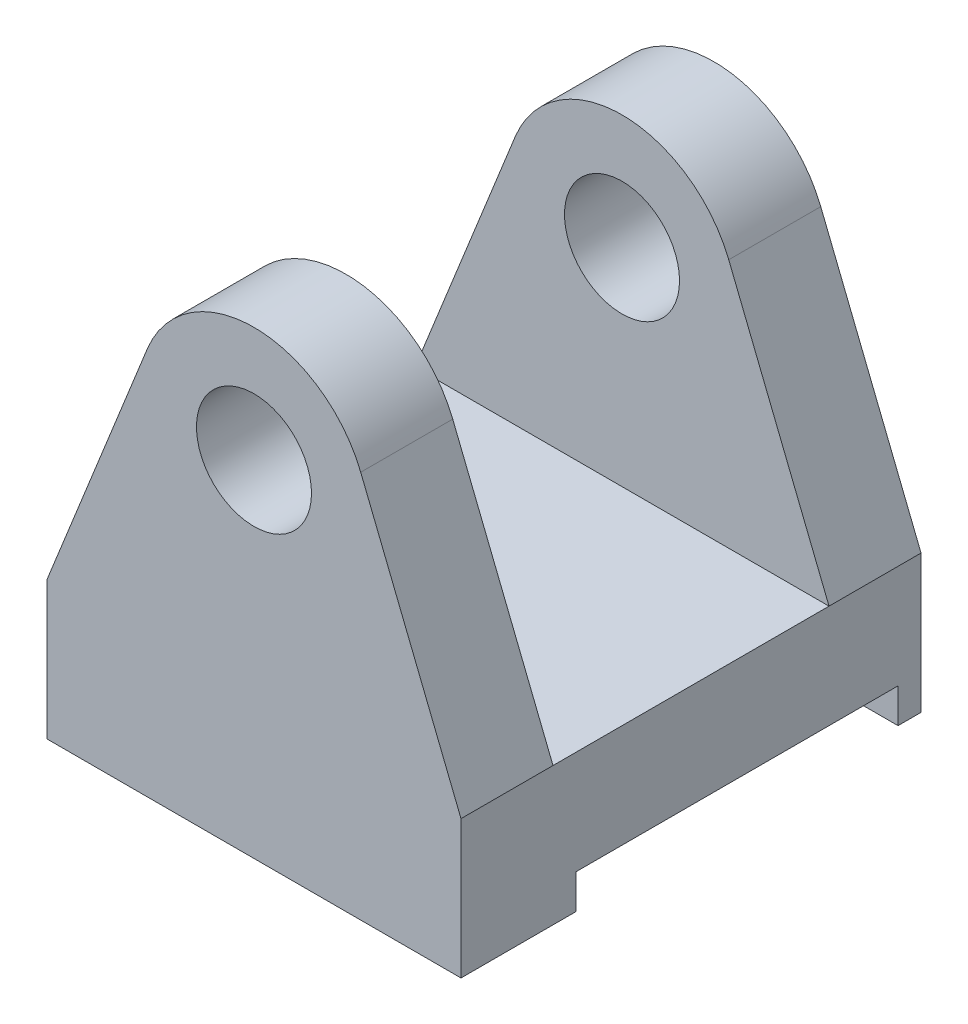
ISO-10303-21;
HEADER;
FILE_DESCRIPTION(('STEP AP214'),'2;1');
FILE_NAME('part.step','',(''),(''),'','','');
FILE_SCHEMA(('AUTOMOTIVE_DESIGN { 1 0 10303 214 1 1 1 1 }'));
ENDSEC;
DATA;
#1=APPLICATION_CONTEXT('core data for automotive mechanical design processes');
#2=APPLICATION_PROTOCOL_DEFINITION('international standard','automotive_design',2000,#1);
#3=PRODUCT_CONTEXT('',#1,'mechanical');
#4=PRODUCT('Part','Part','',(#3));
#5=PRODUCT_RELATED_PRODUCT_CATEGORY('part','',(#4));
#6=PRODUCT_DEFINITION_FORMATION('','',#4);
#7=PRODUCT_DEFINITION_CONTEXT('part definition',#1,'design');
#8=PRODUCT_DEFINITION('design','',#6,#7);
#9=PRODUCT_DEFINITION_SHAPE('','',#8);
#10=(LENGTH_UNIT() NAMED_UNIT(*) SI_UNIT(.MILLI.,.METRE.));
#11=(NAMED_UNIT(*) PLANE_ANGLE_UNIT() SI_UNIT($,.RADIAN.));
#12=(NAMED_UNIT(*) SI_UNIT($,.STERADIAN.) SOLID_ANGLE_UNIT());
#13=UNCERTAINTY_MEASURE_WITH_UNIT(LENGTH_MEASURE(1.E-05),#10,'distance_accuracy_value','');
#14=(GEOMETRIC_REPRESENTATION_CONTEXT(3) GLOBAL_UNCERTAINTY_ASSIGNED_CONTEXT((#13)) GLOBAL_UNIT_ASSIGNED_CONTEXT((#10,
#11,#12)) REPRESENTATION_CONTEXT('',''));
#15=CARTESIAN_POINT('',(0.,0.,0.));
#16=DIRECTION('',(0.,0.,1.));
#17=DIRECTION('',(1.,0.,0.));
#18=AXIS2_PLACEMENT_3D('',#15,#16,#17);
#19=CARTESIAN_POINT('',(-8.78834256779249,3.52734260085929,10.));
#20=DIRECTION('',(-0.928038883928868,0.372483328373313,0.));
#21=DIRECTION('',(-0.372483328373313,-0.928038883928868,0.));
#22=AXIS2_PLACEMENT_3D('',#19,#20,#21);
#23=PLANE('',#22);
#24=DIRECTION('',(0.,0.,-1.));
#25=VECTOR('',#24,1.);
#26=CARTESIAN_POINT('',(-4.64019441964434,13.8624166418666,10.));
#27=LINE('',#26,#25);
#28=CARTESIAN_POINT('',(-4.64019441964434,13.8624166418666,10.));
#29=VERTEX_POINT('',#28);
#30=CARTESIAN_POINT('',(-4.64019441964434,13.8624166418666,6.));
#31=VERTEX_POINT('',#30);
#32=EDGE_CURVE('E56',#29,#31,#27,.T.);
#33=ORIENTED_EDGE('',*,*,#32,.T.);
#34=DIRECTION('',(-0.372483328373313,-0.928038883928868,0.));
#35=VECTOR('',#34,1.);
#36=CARTESIAN_POINT('',(-8.78834256779249,3.52734260085929,6.));
#37=LINE('',#36,#35);
#38=CARTESIAN_POINT('',(-9.,3.,6.));
#39=VERTEX_POINT('',#38);
#40=EDGE_CURVE('E322',#31,#39,#37,.T.);
#41=ORIENTED_EDGE('',*,*,#40,.T.);
#42=DIRECTION('',(0.,0.,-1.));
#43=VECTOR('',#42,1.);
#44=CARTESIAN_POINT('',(-9.,3.,10.));
#45=LINE('',#44,#43);
#46=CARTESIAN_POINT('',(-9.,3.,10.));
#47=VERTEX_POINT('',#46);
#48=EDGE_CURVE('E214',#47,#39,#45,.T.);
#49=ORIENTED_EDGE('',*,*,#48,.F.);
#50=DIRECTION('',(0.372483328373313,0.928038883928868,0.));
#51=VECTOR('',#50,1.);
#52=CARTESIAN_POINT('',(-8.78834256779249,3.52734260085929,10.));
#53=LINE('',#52,#51);
#54=EDGE_CURVE('E194',#47,#29,#53,.T.);
#55=ORIENTED_EDGE('',*,*,#54,.T.);
#56=EDGE_LOOP('',(#33,#41,#49,#55));
#57=FACE_BOUND('',#56,.T.);
#58=ADVANCED_FACE('F50',(#57),#23,.T.);
#59=CARTESIAN_POINT('',(8.78834256779249,3.5273426008593,10.));
#60=DIRECTION('',(0.928038883928868,0.372483328373313,0.));
#61=DIRECTION('',(-0.372483328373313,0.928038883928868,0.));
#62=AXIS2_PLACEMENT_3D('',#59,#60,#61);
#63=PLANE('',#62);
#64=DIRECTION('',(0.,0.,-1.));
#65=VECTOR('',#64,1.);
#66=CARTESIAN_POINT('',(9.,3.,10.));
#67=LINE('',#66,#65);
#68=CARTESIAN_POINT('',(9.,3.,10.));
#69=VERTEX_POINT('',#68);
#70=CARTESIAN_POINT('',(9.,3.,6.));
#71=VERTEX_POINT('',#70);
#72=EDGE_CURVE('E199',#69,#71,#67,.T.);
#73=ORIENTED_EDGE('',*,*,#72,.T.);
#74=DIRECTION('',(-0.372483328373313,0.928038883928868,0.));
#75=VECTOR('',#74,1.);
#76=CARTESIAN_POINT('',(8.78834256779249,3.5273426008593,6.));
#77=LINE('',#76,#75);
#78=CARTESIAN_POINT('',(4.64019441964434,13.8624166418666,6.));
#79=VERTEX_POINT('',#78);
#80=EDGE_CURVE('E331',#71,#79,#77,.T.);
#81=ORIENTED_EDGE('',*,*,#80,.T.);
#82=DIRECTION('',(0.,0.,-1.));
#83=VECTOR('',#82,1.);
#84=CARTESIAN_POINT('',(4.64019441964434,13.8624166418666,10.));
#85=LINE('',#84,#83);
#86=CARTESIAN_POINT('',(4.64019441964434,13.8624166418666,10.));
#87=VERTEX_POINT('',#86);
#88=EDGE_CURVE('E171',#87,#79,#85,.T.);
#89=ORIENTED_EDGE('',*,*,#88,.F.);
#90=DIRECTION('',(0.372483328373313,-0.928038883928868,0.));
#91=VECTOR('',#90,1.);
#92=CARTESIAN_POINT('',(8.78834256779249,3.5273426008593,10.));
#93=LINE('',#92,#91);
#94=EDGE_CURVE('E175',#87,#69,#93,.T.);
#95=ORIENTED_EDGE('',*,*,#94,.T.);
#96=EDGE_LOOP('',(#73,#81,#89,#95));
#97=FACE_BOUND('',#96,.T.);
#98=ADVANCED_FACE('F296',(#97),#63,.T.);
#99=CARTESIAN_POINT('',(0.,12.,10.));
#100=DIRECTION('',(0.,0.,-1.));
#101=DIRECTION('',(-1.,0.,0.));
#102=AXIS2_PLACEMENT_3D('',#99,#100,#101);
#103=CYLINDRICAL_SURFACE('',#102,5.);
#104=CARTESIAN_POINT('',(0.,12.,-6.));
#105=DIRECTION('',(0.,0.,1.));
#106=DIRECTION('',(1.,0.,0.));
#107=AXIS2_PLACEMENT_3D('',#104,#105,#106);
#108=CIRCLE('',#107,5.);
#109=CARTESIAN_POINT('',(4.64019441964434,13.8624166418666,-6.));
#110=VERTEX_POINT('',#109);
#111=CARTESIAN_POINT('',(-4.64019441964434,13.8624166418666,-6.));
#112=VERTEX_POINT('',#111);
#113=EDGE_CURVE('E105',#110,#112,#108,.T.);
#114=ORIENTED_EDGE('',*,*,#113,.F.);
#115=CARTESIAN_POINT('',(4.64019441964434,13.8624166418666,-10.));
#116=VERTEX_POINT('',#115);
#117=EDGE_CURVE('E163',#110,#116,#85,.T.);
#118=ORIENTED_EDGE('',*,*,#117,.T.);
#119=CARTESIAN_POINT('',(0.,12.,-10.));
#120=DIRECTION('',(0.,0.,1.));
#121=DIRECTION('',(1.,0.,0.));
#122=AXIS2_PLACEMENT_3D('',#119,#120,#121);
#123=CIRCLE('',#122,5.);
#124=CARTESIAN_POINT('',(-4.64019441964434,13.8624166418666,-10.));
#125=VERTEX_POINT('',#124);
#126=EDGE_CURVE('E169',#116,#125,#123,.T.);
#127=ORIENTED_EDGE('',*,*,#126,.T.);
#128=EDGE_CURVE('E218',#112,#125,#27,.T.);
#129=ORIENTED_EDGE('',*,*,#128,.F.);
#130=EDGE_LOOP('',(#114,#118,#127,#129));
#131=FACE_BOUND('',#130,.T.);
#132=ADVANCED_FACE('F167',(#131),#103,.T.);
#133=CARTESIAN_POINT('',(0.,-3.,10.));
#134=DIRECTION('',(0.,1.,0.));
#135=DIRECTION('',(0.,0.,1.));
#136=AXIS2_PLACEMENT_3D('',#133,#134,#135);
#137=PLANE('',#136);
#138=DIRECTION('',(0.,0.,-1.));
#139=VECTOR('',#138,1.);
#140=CARTESIAN_POINT('',(9.,-3.,10.));
#141=LINE('',#140,#139);
#142=CARTESIAN_POINT('',(9.,-3.,-9.));
#143=VERTEX_POINT('',#142);
#144=CARTESIAN_POINT('',(9.,-3.,-10.));
#145=VERTEX_POINT('',#144);
#146=EDGE_CURVE('E204',#143,#145,#141,.T.);
#147=ORIENTED_EDGE('',*,*,#146,.F.);
#148=DIRECTION('',(-1.,0.,0.));
#149=VECTOR('',#148,1.);
#150=CARTESIAN_POINT('',(0.,-3.,-9.));
#151=LINE('',#150,#149);
#152=CARTESIAN_POINT('',(-9.,-3.,-9.));
#153=VERTEX_POINT('',#152);
#154=EDGE_CURVE('E181',#143,#153,#151,.T.);
#155=ORIENTED_EDGE('',*,*,#154,.T.);
#156=DIRECTION('',(0.,0.,-1.));
#157=VECTOR('',#156,1.);
#158=CARTESIAN_POINT('',(-9.,-3.,10.));
#159=LINE('',#158,#157);
#160=CARTESIAN_POINT('',(-9.,-3.,-10.));
#161=VERTEX_POINT('',#160);
#162=EDGE_CURVE('E207',#153,#161,#159,.T.);
#163=ORIENTED_EDGE('',*,*,#162,.T.);
#164=DIRECTION('',(1.,0.,0.));
#165=VECTOR('',#164,1.);
#166=CARTESIAN_POINT('',(0.,-3.,-10.));
#167=LINE('',#166,#165);
#168=EDGE_CURVE('E191',#161,#145,#167,.T.);
#169=ORIENTED_EDGE('',*,*,#168,.T.);
#170=EDGE_LOOP('',(#147,#155,#163,#169));
#171=FACE_BOUND('',#170,.T.);
#172=ADVANCED_FACE('F303',(#171),#137,.F.);
#173=ORIENTED_EDGE('',*,*,#88,.T.);
#174=CARTESIAN_POINT('',(0.,12.,6.));
#175=DIRECTION('',(0.,0.,1.));
#176=DIRECTION('',(1.,0.,0.));
#177=AXIS2_PLACEMENT_3D('',#174,#175,#176);
#178=CIRCLE('',#177,5.);
#179=EDGE_CURVE('E328',#79,#31,#178,.T.);
#180=ORIENTED_EDGE('',*,*,#179,.T.);
#181=ORIENTED_EDGE('',*,*,#32,.F.);
#182=CARTESIAN_POINT('',(0.,12.,10.));
#183=DIRECTION('',(0.,0.,1.));
#184=DIRECTION('',(1.,0.,0.));
#185=AXIS2_PLACEMENT_3D('',#182,#183,#184);
#186=CIRCLE('',#185,5.);
#187=EDGE_CURVE('E190',#87,#29,#186,.T.);
#188=ORIENTED_EDGE('',*,*,#187,.F.);
#189=EDGE_LOOP('',(#173,#180,#181,#188));
#190=FACE_BOUND('',#189,.T.);
#191=ADVANCED_FACE('F47',(#190),#103,.T.);
#192=DIRECTION('',(-0.372483328373313,-0.928038883928868,0.));
#193=VECTOR('',#192,1.);
#194=CARTESIAN_POINT('',(-8.78834256779249,3.52734260085929,-6.));
#195=LINE('',#194,#193);
#196=CARTESIAN_POINT('',(-9.,3.,-6.));
#197=VERTEX_POINT('',#196);
#198=EDGE_CURVE('E334',#112,#197,#195,.T.);
#199=ORIENTED_EDGE('',*,*,#198,.F.);
#200=ORIENTED_EDGE('',*,*,#128,.T.);
#201=DIRECTION('',(0.372483328373313,0.928038883928868,0.));
#202=VECTOR('',#201,1.);
#203=CARTESIAN_POINT('',(-8.78834256779249,3.52734260085929,-10.));
#204=LINE('',#203,#202);
#205=CARTESIAN_POINT('',(-9.,3.,-10.));
#206=VERTEX_POINT('',#205);
#207=EDGE_CURVE('E182',#206,#125,#204,.T.);
#208=ORIENTED_EDGE('',*,*,#207,.F.);
#209=EDGE_CURVE('E212',#197,#206,#45,.T.);
#210=ORIENTED_EDGE('',*,*,#209,.F.);
#211=EDGE_LOOP('',(#199,#200,#208,#210));
#212=FACE_BOUND('',#211,.T.);
#213=ADVANCED_FACE('F307',(#212),#23,.T.);
#214=CARTESIAN_POINT('',(-9.,0.,10.));
#215=DIRECTION('',(1.,0.,0.));
#216=DIRECTION('',(0.,0.,-1.));
#217=AXIS2_PLACEMENT_3D('',#214,#215,#216);
#218=PLANE('',#217);
#219=ORIENTED_EDGE('',*,*,#162,.F.);
#220=DIRECTION('',(0.,1.,0.));
#221=VECTOR('',#220,1.);
#222=CARTESIAN_POINT('',(-9.,-1.5,-9.));
#223=LINE('',#222,#221);
#224=CARTESIAN_POINT('',(-9.,-1.5,-9.));
#225=VERTEX_POINT('',#224);
#226=EDGE_CURVE('E223',#153,#225,#223,.T.);
#227=ORIENTED_EDGE('',*,*,#226,.T.);
#228=DIRECTION('',(0.,0.,1.));
#229=VECTOR('',#228,1.);
#230=CARTESIAN_POINT('',(-9.,-1.5,5.));
#231=LINE('',#230,#229);
#232=CARTESIAN_POINT('',(-9.,-1.5,5.));
#233=VERTEX_POINT('',#232);
#234=EDGE_CURVE('E351',#225,#233,#231,.T.);
#235=ORIENTED_EDGE('',*,*,#234,.T.);
#236=DIRECTION('',(0.,-1.,0.));
#237=VECTOR('',#236,1.);
#238=CARTESIAN_POINT('',(-9.,-1.5,5.));
#239=LINE('',#238,#237);
#240=CARTESIAN_POINT('',(-9.,-3.,5.));
#241=VERTEX_POINT('',#240);
#242=EDGE_CURVE('E354',#233,#241,#239,.T.);
#243=ORIENTED_EDGE('',*,*,#242,.T.);
#244=CARTESIAN_POINT('',(-9.,-3.,10.));
#245=VERTEX_POINT('',#244);
#246=EDGE_CURVE('E209',#245,#241,#159,.T.);
#247=ORIENTED_EDGE('',*,*,#246,.F.);
#248=DIRECTION('',(0.,-1.,0.));
#249=VECTOR('',#248,1.);
#250=CARTESIAN_POINT('',(-9.,0.,10.));
#251=LINE('',#250,#249);
#252=EDGE_CURVE('E373',#47,#245,#251,.T.);
#253=ORIENTED_EDGE('',*,*,#252,.F.);
#254=ORIENTED_EDGE('',*,*,#48,.T.);
#255=DIRECTION('',(0.,0.,1.));
#256=VECTOR('',#255,1.);
#257=CARTESIAN_POINT('',(-9.,3.,-6.));
#258=LINE('',#257,#256);
#259=EDGE_CURVE('E343',#197,#39,#258,.T.);
#260=ORIENTED_EDGE('',*,*,#259,.F.);
#261=ORIENTED_EDGE('',*,*,#209,.T.);
#262=DIRECTION('',(0.,-1.,0.));
#263=VECTOR('',#262,1.);
#264=CARTESIAN_POINT('',(-9.,0.,-10.));
#265=LINE('',#264,#263);
#266=EDGE_CURVE('E389',#206,#161,#265,.T.);
#267=ORIENTED_EDGE('',*,*,#266,.T.);
#268=EDGE_LOOP('',(#219,#227,#235,#243,#247,#253,#254,#260,#261,#267));
#269=FACE_BOUND('',#268,.T.);
#270=ADVANCED_FACE('F305',(#269),#218,.F.);
#271=ORIENTED_EDGE('',*,*,#246,.T.);
#272=DIRECTION('',(1.,0.,0.));
#273=VECTOR('',#272,1.);
#274=CARTESIAN_POINT('',(0.,-3.,5.));
#275=LINE('',#274,#273);
#276=CARTESIAN_POINT('',(9.,-3.,5.));
#277=VERTEX_POINT('',#276);
#278=EDGE_CURVE('E364',#241,#277,#275,.T.);
#279=ORIENTED_EDGE('',*,*,#278,.T.);
#280=CARTESIAN_POINT('',(9.,-3.,10.));
#281=VERTEX_POINT('',#280);
#282=EDGE_CURVE('E202',#281,#277,#141,.T.);
#283=ORIENTED_EDGE('',*,*,#282,.F.);
#284=DIRECTION('',(1.,0.,0.));
#285=VECTOR('',#284,1.);
#286=CARTESIAN_POINT('',(0.,-3.,10.));
#287=LINE('',#286,#285);
#288=EDGE_CURVE('E376',#245,#281,#287,.T.);
#289=ORIENTED_EDGE('',*,*,#288,.F.);
#290=EDGE_LOOP('',(#271,#279,#283,#289));
#291=FACE_BOUND('',#290,.T.);
#292=ADVANCED_FACE('F298',(#291),#137,.F.);
#293=CARTESIAN_POINT('',(9.,0.,10.));
#294=DIRECTION('',(1.,0.,0.));
#295=DIRECTION('',(0.,0.,-1.));
#296=AXIS2_PLACEMENT_3D('',#293,#294,#295);
#297=PLANE('',#296);
#298=DIRECTION('',(0.,1.,0.));
#299=VECTOR('',#298,1.);
#300=CARTESIAN_POINT('',(9.,0.,-9.));
#301=LINE('',#300,#299);
#302=CARTESIAN_POINT('',(9.,-1.5,-9.));
#303=VERTEX_POINT('',#302);
#304=EDGE_CURVE('E11',#143,#303,#301,.T.);
#305=ORIENTED_EDGE('',*,*,#304,.F.);
#306=ORIENTED_EDGE('',*,*,#146,.T.);
#307=DIRECTION('',(0.,-1.,0.));
#308=VECTOR('',#307,1.);
#309=CARTESIAN_POINT('',(9.,0.,-10.));
#310=LINE('',#309,#308);
#311=CARTESIAN_POINT('',(9.,3.,-10.));
#312=VERTEX_POINT('',#311);
#313=EDGE_CURVE('E187',#312,#145,#310,.T.);
#314=ORIENTED_EDGE('',*,*,#313,.F.);
#315=CARTESIAN_POINT('',(9.,3.,-6.));
#316=VERTEX_POINT('',#315);
#317=EDGE_CURVE('E158',#316,#312,#67,.T.);
#318=ORIENTED_EDGE('',*,*,#317,.F.);
#319=DIRECTION('',(0.,0.,1.));
#320=VECTOR('',#319,1.);
#321=CARTESIAN_POINT('',(9.,3.,-6.));
#322=LINE('',#321,#320);
#323=EDGE_CURVE('E228',#316,#71,#322,.T.);
#324=ORIENTED_EDGE('',*,*,#323,.T.);
#325=ORIENTED_EDGE('',*,*,#72,.F.);
#326=DIRECTION('',(0.,-1.,0.));
#327=VECTOR('',#326,1.);
#328=CARTESIAN_POINT('',(9.,0.,10.));
#329=LINE('',#328,#327);
#330=EDGE_CURVE('E377',#69,#281,#329,.T.);
#331=ORIENTED_EDGE('',*,*,#330,.T.);
#332=ORIENTED_EDGE('',*,*,#282,.T.);
#333=DIRECTION('',(0.,-1.,0.));
#334=VECTOR('',#333,1.);
#335=CARTESIAN_POINT('',(9.,0.,5.));
#336=LINE('',#335,#334);
#337=CARTESIAN_POINT('',(9.,-1.5,5.));
#338=VERTEX_POINT('',#337);
#339=EDGE_CURVE('E76',#338,#277,#336,.T.);
#340=ORIENTED_EDGE('',*,*,#339,.F.);
#341=DIRECTION('',(0.,0.,1.));
#342=VECTOR('',#341,1.);
#343=CARTESIAN_POINT('',(9.,-1.5,10.));
#344=LINE('',#343,#342);
#345=EDGE_CURVE('E226',#303,#338,#344,.T.);
#346=ORIENTED_EDGE('',*,*,#345,.F.);
#347=EDGE_LOOP('',(#305,#306,#314,#318,#324,#325,#331,#332,#340,#346));
#348=FACE_BOUND('',#347,.T.);
#349=ADVANCED_FACE('F293',(#348),#297,.T.);
#350=DIRECTION('',(-0.372483328373313,0.928038883928868,0.));
#351=VECTOR('',#350,1.);
#352=CARTESIAN_POINT('',(8.78834256779249,3.5273426008593,-6.));
#353=LINE('',#352,#351);
#354=EDGE_CURVE('E407',#316,#110,#353,.T.);
#355=ORIENTED_EDGE('',*,*,#354,.F.);
#356=ORIENTED_EDGE('',*,*,#317,.T.);
#357=DIRECTION('',(0.372483328373313,-0.928038883928868,0.));
#358=VECTOR('',#357,1.);
#359=CARTESIAN_POINT('',(8.78834256779249,3.5273426008593,-10.));
#360=LINE('',#359,#358);
#361=EDGE_CURVE('E180',#116,#312,#360,.T.);
#362=ORIENTED_EDGE('',*,*,#361,.F.);
#363=ORIENTED_EDGE('',*,*,#117,.F.);
#364=EDGE_LOOP('',(#355,#356,#362,#363));
#365=FACE_BOUND('',#364,.T.);
#366=ADVANCED_FACE('F183',(#365),#63,.T.);
#367=CARTESIAN_POINT('',(0.,0.,10.));
#368=DIRECTION('',(0.,0.,1.));
#369=DIRECTION('',(1.,0.,0.));
#370=AXIS2_PLACEMENT_3D('',#367,#368,#369);
#371=PLANE('',#370);
#372=CARTESIAN_POINT('',(0.,12.,10.000012));
#373=DIRECTION('',(0.,0.,1.));
#374=DIRECTION('',(1.,0.,0.));
#375=AXIS2_PLACEMENT_3D('',#372,#373,#374);
#376=CIRCLE('',#375,2.5);
#377=CARTESIAN_POINT('',(2.5,12.,10.000012));
#378=VERTEX_POINT('',#377);
#379=EDGE_CURVE('E239',#378,#378,#376,.T.);
#380=ORIENTED_EDGE('',*,*,#379,.F.);
#381=EDGE_LOOP('',(#380));
#382=FACE_BOUND('',#381,.T.);
#383=ORIENTED_EDGE('',*,*,#187,.T.);
#384=ORIENTED_EDGE('',*,*,#54,.F.);
#385=ORIENTED_EDGE('',*,*,#252,.T.);
#386=ORIENTED_EDGE('',*,*,#288,.T.);
#387=ORIENTED_EDGE('',*,*,#330,.F.);
#388=ORIENTED_EDGE('',*,*,#94,.F.);
#389=EDGE_LOOP('',(#383,#384,#385,#386,#387,#388));
#390=FACE_BOUND('',#389,.T.);
#391=ADVANCED_FACE('F238',(#382,#390),#371,.T.);
#392=CARTESIAN_POINT('',(0.,0.,-10.));
#393=DIRECTION('',(0.,0.,1.));
#394=DIRECTION('',(1.,0.,0.));
#395=AXIS2_PLACEMENT_3D('',#392,#393,#394);
#396=PLANE('',#395);
#397=CARTESIAN_POINT('',(0.,12.,-10.));
#398=DIRECTION('',(0.,0.,1.));
#399=DIRECTION('',(1.,0.,0.));
#400=AXIS2_PLACEMENT_3D('',#397,#398,#399);
#401=CIRCLE('',#400,2.5);
#402=CARTESIAN_POINT('',(2.5,12.,-10.));
#403=VERTEX_POINT('',#402);
#404=EDGE_CURVE('E233',#403,#403,#401,.T.);
#405=ORIENTED_EDGE('',*,*,#404,.T.);
#406=EDGE_LOOP('',(#405));
#407=FACE_BOUND('',#406,.T.);
#408=ORIENTED_EDGE('',*,*,#126,.F.);
#409=ORIENTED_EDGE('',*,*,#361,.T.);
#410=ORIENTED_EDGE('',*,*,#313,.T.);
#411=ORIENTED_EDGE('',*,*,#168,.F.);
#412=ORIENTED_EDGE('',*,*,#266,.F.);
#413=ORIENTED_EDGE('',*,*,#207,.T.);
#414=EDGE_LOOP('',(#408,#409,#410,#411,#412,#413));
#415=FACE_BOUND('',#414,.T.);
#416=ADVANCED_FACE('F177',(#407,#415),#396,.F.);
#417=CARTESIAN_POINT('',(-9.,-1.5,-9.));
#418=DIRECTION('',(0.,0.,-1.));
#419=DIRECTION('',(-1.,0.,0.));
#420=AXIS2_PLACEMENT_3D('',#417,#418,#419);
#421=PLANE('',#420);
#422=ORIENTED_EDGE('',*,*,#304,.T.);
#423=DIRECTION('',(1.,0.,0.));
#424=VECTOR('',#423,1.);
#425=CARTESIAN_POINT('',(-9.,-1.5,-9.));
#426=LINE('',#425,#424);
#427=EDGE_CURVE('E356',#225,#303,#426,.T.);
#428=ORIENTED_EDGE('',*,*,#427,.F.);
#429=ORIENTED_EDGE('',*,*,#226,.F.);
#430=ORIENTED_EDGE('',*,*,#154,.F.);
#431=EDGE_LOOP('',(#422,#428,#429,#430));
#432=FACE_BOUND('',#431,.T.);
#433=ADVANCED_FACE('F282',(#432),#421,.F.);
#434=CARTESIAN_POINT('',(-9.,-1.5,5.));
#435=DIRECTION('',(0.,0.,1.));
#436=DIRECTION('',(1.,0.,0.));
#437=AXIS2_PLACEMENT_3D('',#434,#435,#436);
#438=PLANE('',#437);
#439=ORIENTED_EDGE('',*,*,#242,.F.);
#440=DIRECTION('',(1.,0.,0.));
#441=VECTOR('',#440,1.);
#442=CARTESIAN_POINT('',(-9.,-1.5,5.));
#443=LINE('',#442,#441);
#444=EDGE_CURVE('E362',#233,#338,#443,.T.);
#445=ORIENTED_EDGE('',*,*,#444,.T.);
#446=ORIENTED_EDGE('',*,*,#339,.T.);
#447=ORIENTED_EDGE('',*,*,#278,.F.);
#448=EDGE_LOOP('',(#439,#445,#446,#447));
#449=FACE_BOUND('',#448,.T.);
#450=ADVANCED_FACE('F278',(#449),#438,.F.);
#451=CARTESIAN_POINT('',(-9.,-1.5,5.));
#452=DIRECTION('',(0.,1.,0.));
#453=DIRECTION('',(0.,0.,1.));
#454=AXIS2_PLACEMENT_3D('',#451,#452,#453);
#455=PLANE('',#454);
#456=ORIENTED_EDGE('',*,*,#444,.F.);
#457=ORIENTED_EDGE('',*,*,#234,.F.);
#458=ORIENTED_EDGE('',*,*,#427,.T.);
#459=ORIENTED_EDGE('',*,*,#345,.T.);
#460=EDGE_LOOP('',(#456,#457,#458,#459));
#461=FACE_BOUND('',#460,.T.);
#462=ADVANCED_FACE('F279',(#461),#455,.F.);
#463=CARTESIAN_POINT('',(0.,3.,-6.));
#464=DIRECTION('',(0.,-1.,0.));
#465=DIRECTION('',(0.,0.,-1.));
#466=AXIS2_PLACEMENT_3D('',#463,#464,#465);
#467=PLANE('',#466);
#468=DIRECTION('',(1.,0.,0.));
#469=VECTOR('',#468,1.);
#470=CARTESIAN_POINT('',(0.,3.,6.));
#471=LINE('',#470,#469);
#472=EDGE_CURVE('E337',#39,#71,#471,.T.);
#473=ORIENTED_EDGE('',*,*,#472,.T.);
#474=ORIENTED_EDGE('',*,*,#323,.F.);
#475=DIRECTION('',(1.,0.,0.));
#476=VECTOR('',#475,1.);
#477=CARTESIAN_POINT('',(0.,3.,-6.));
#478=LINE('',#477,#476);
#479=EDGE_CURVE('E69',#197,#316,#478,.T.);
#480=ORIENTED_EDGE('',*,*,#479,.F.);
#481=ORIENTED_EDGE('',*,*,#259,.T.);
#482=EDGE_LOOP('',(#473,#474,#480,#481));
#483=FACE_BOUND('',#482,.T.);
#484=ADVANCED_FACE('F271',(#483),#467,.F.);
#485=CARTESIAN_POINT('',(0.,0.,-6.));
#486=DIRECTION('',(0.,0.,1.));
#487=DIRECTION('',(1.,0.,0.));
#488=AXIS2_PLACEMENT_3D('',#485,#486,#487);
#489=PLANE('',#488);
#490=CARTESIAN_POINT('',(0.,12.,-6.));
#491=DIRECTION('',(0.,0.,1.));
#492=DIRECTION('',(1.,0.,0.));
#493=AXIS2_PLACEMENT_3D('',#490,#491,#492);
#494=CIRCLE('',#493,2.5);
#495=CARTESIAN_POINT('',(2.5,12.,-6.));
#496=VERTEX_POINT('',#495);
#497=EDGE_CURVE('E231',#496,#496,#494,.T.);
#498=ORIENTED_EDGE('',*,*,#497,.F.);
#499=EDGE_LOOP('',(#498));
#500=FACE_BOUND('',#499,.T.);
#501=ORIENTED_EDGE('',*,*,#198,.T.);
#502=ORIENTED_EDGE('',*,*,#479,.T.);
#503=ORIENTED_EDGE('',*,*,#354,.T.);
#504=ORIENTED_EDGE('',*,*,#113,.T.);
#505=EDGE_LOOP('',(#501,#502,#503,#504));
#506=FACE_BOUND('',#505,.T.);
#507=ADVANCED_FACE('F270',(#500,#506),#489,.T.);
#508=CARTESIAN_POINT('',(0.,0.,6.));
#509=DIRECTION('',(0.,0.,1.));
#510=DIRECTION('',(1.,0.,0.));
#511=AXIS2_PLACEMENT_3D('',#508,#509,#510);
#512=PLANE('',#511);
#513=CARTESIAN_POINT('',(0.,12.,6.));
#514=DIRECTION('',(0.,0.,1.));
#515=DIRECTION('',(1.,0.,0.));
#516=AXIS2_PLACEMENT_3D('',#513,#514,#515);
#517=CIRCLE('',#516,2.5);
#518=CARTESIAN_POINT('',(2.5,12.,6.));
#519=VERTEX_POINT('',#518);
#520=EDGE_CURVE('E232',#519,#519,#517,.T.);
#521=ORIENTED_EDGE('',*,*,#520,.T.);
#522=EDGE_LOOP('',(#521));
#523=FACE_BOUND('',#522,.T.);
#524=ORIENTED_EDGE('',*,*,#40,.F.);
#525=ORIENTED_EDGE('',*,*,#179,.F.);
#526=ORIENTED_EDGE('',*,*,#80,.F.);
#527=ORIENTED_EDGE('',*,*,#472,.F.);
#528=EDGE_LOOP('',(#524,#525,#526,#527));
#529=FACE_BOUND('',#528,.T.);
#530=ADVANCED_FACE('F269',(#523,#529),#512,.F.);
#531=CARTESIAN_POINT('',(0.,12.,-10.));
#532=DIRECTION('',(0.,0.,1.));
#533=DIRECTION('',(1.,0.,0.));
#534=AXIS2_PLACEMENT_3D('',#531,#532,#533);
#535=CYLINDRICAL_SURFACE('',#534,2.5);
#536=ORIENTED_EDGE('',*,*,#379,.T.);
#537=EDGE_LOOP('',(#536));
#538=FACE_BOUND('',#537,.T.);
#539=ORIENTED_EDGE('',*,*,#520,.F.);
#540=EDGE_LOOP('',(#539));
#541=FACE_BOUND('',#540,.T.);
#542=ADVANCED_FACE('F264',(#538,#541),#535,.F.);
#543=ORIENTED_EDGE('',*,*,#497,.T.);
#544=EDGE_LOOP('',(#543));
#545=FACE_BOUND('',#544,.T.);
#546=ORIENTED_EDGE('',*,*,#404,.F.);
#547=EDGE_LOOP('',(#546));
#548=FACE_BOUND('',#547,.T.);
#549=ADVANCED_FACE('F258',(#545,#548),#535,.F.);
#550=CLOSED_SHELL('',(#58,#98,#132,#172,#191,#213,#270,#292,#349,#366,#391,#416,#433,#450,#462,
#484,#507,#530,#542,#549));
#551=MANIFOLD_SOLID_BREP('B2',#550);
#552=ADVANCED_BREP_SHAPE_REPRESENTATION('',(#18,#551),#14);
#553=SHAPE_DEFINITION_REPRESENTATION(#9,#552);
ENDSEC;
END-ISO-10303-21;
